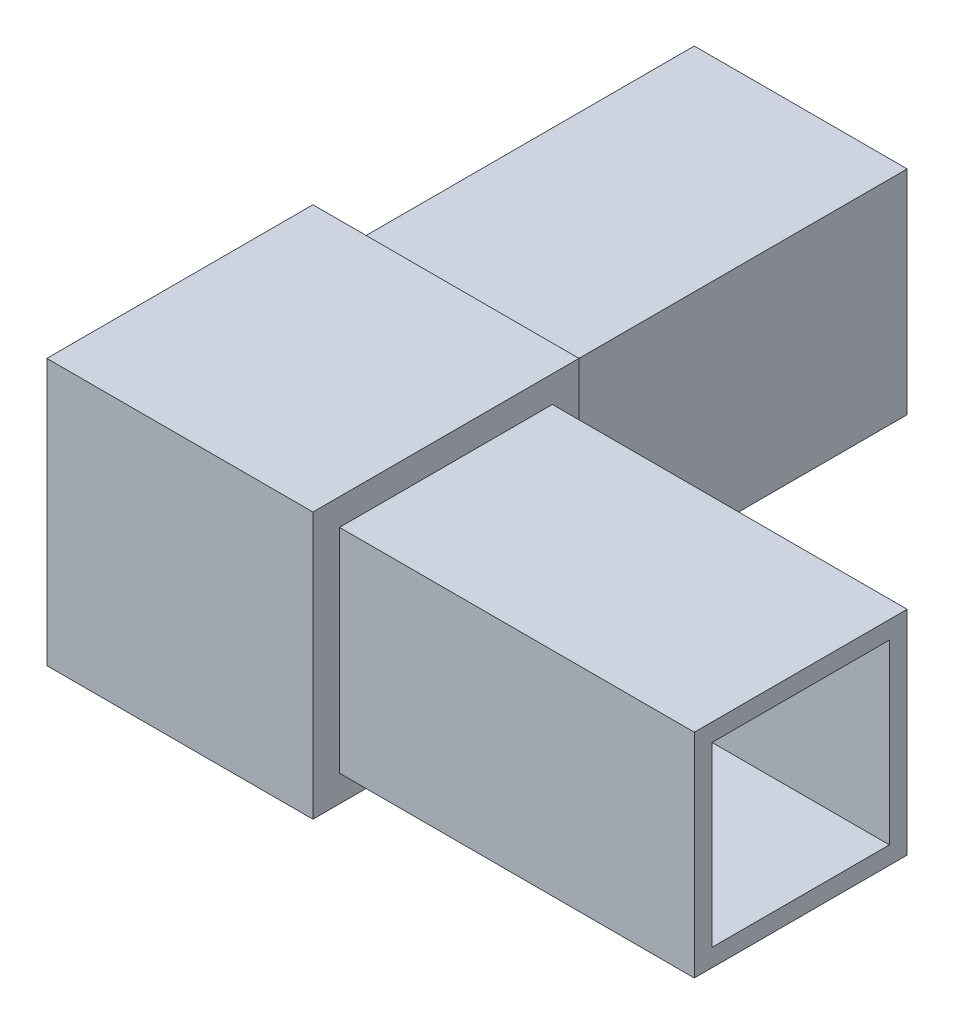
ISO-10303-21;
HEADER;
FILE_DESCRIPTION(('STEP AP214'),'2;1');
FILE_NAME('part.step','',(''),(''),'','','');
FILE_SCHEMA(('AUTOMOTIVE_DESIGN { 1 0 10303 214 1 1 1 1 }'));
ENDSEC;
DATA;
#1=APPLICATION_CONTEXT('core data for automotive mechanical design processes');
#2=APPLICATION_PROTOCOL_DEFINITION('international standard','automotive_design',2000,#1);
#3=PRODUCT_CONTEXT('',#1,'mechanical');
#4=PRODUCT('Part','Part','',(#3));
#5=PRODUCT_RELATED_PRODUCT_CATEGORY('part','',(#4));
#6=PRODUCT_DEFINITION_FORMATION('','',#4);
#7=PRODUCT_DEFINITION_CONTEXT('part definition',#1,'design');
#8=PRODUCT_DEFINITION('design','',#6,#7);
#9=PRODUCT_DEFINITION_SHAPE('','',#8);
#10=(LENGTH_UNIT() NAMED_UNIT(*) SI_UNIT(.MILLI.,.METRE.));
#11=(NAMED_UNIT(*) PLANE_ANGLE_UNIT() SI_UNIT($,.RADIAN.));
#12=(NAMED_UNIT(*) SI_UNIT($,.STERADIAN.) SOLID_ANGLE_UNIT());
#13=UNCERTAINTY_MEASURE_WITH_UNIT(LENGTH_MEASURE(1.E-05),#10,'distance_accuracy_value','');
#14=(GEOMETRIC_REPRESENTATION_CONTEXT(3) GLOBAL_UNCERTAINTY_ASSIGNED_CONTEXT((#13)) GLOBAL_UNIT_ASSIGNED_CONTEXT((#10,
#11,#12)) REPRESENTATION_CONTEXT('',''));
#15=CARTESIAN_POINT('',(0.,0.,0.));
#16=DIRECTION('',(0.,0.,1.));
#17=DIRECTION('',(1.,0.,0.));
#18=AXIS2_PLACEMENT_3D('',#15,#16,#17);
#19=CARTESIAN_POINT('',(55.,30.,-14.0461219660689));
#20=DIRECTION('',(-1.,0.,0.));
#21=DIRECTION('',(0.,0.,1.));
#22=AXIS2_PLACEMENT_3D('',#19,#20,#21);
#23=PLANE('',#22);
#24=DIRECTION('',(0.,-1.,0.));
#25=VECTOR('',#24,1.);
#26=CARTESIAN_POINT('',(55.,27.,12.));
#27=LINE('',#26,#25);
#28=CARTESIAN_POINT('',(55.,27.,12.));
#29=VERTEX_POINT('',#28);
#30=CARTESIAN_POINT('',(55.,3.,12.));
#31=VERTEX_POINT('',#30);
#32=EDGE_CURVE('E341',#29,#31,#27,.T.);
#33=ORIENTED_EDGE('',*,*,#32,.T.);
#34=DIRECTION('',(0.,0.,-1.));
#35=VECTOR('',#34,1.);
#36=CARTESIAN_POINT('',(55.,3.,12.));
#37=LINE('',#36,#35);
#38=CARTESIAN_POINT('',(55.,3.,-12.));
#39=VERTEX_POINT('',#38);
#40=EDGE_CURVE('E358',#31,#39,#37,.T.);
#41=ORIENTED_EDGE('',*,*,#40,.T.);
#42=DIRECTION('',(0.,1.,0.));
#43=VECTOR('',#42,1.);
#44=CARTESIAN_POINT('',(55.,3.,-12.));
#45=LINE('',#44,#43);
#46=CARTESIAN_POINT('',(55.,27.,-12.));
#47=VERTEX_POINT('',#46);
#48=EDGE_CURVE('E361',#39,#47,#45,.T.);
#49=ORIENTED_EDGE('',*,*,#48,.T.);
#50=DIRECTION('',(0.,0.,1.));
#51=VECTOR('',#50,1.);
#52=CARTESIAN_POINT('',(55.,27.,-12.));
#53=LINE('',#52,#51);
#54=EDGE_CURVE('E346',#47,#29,#53,.T.);
#55=ORIENTED_EDGE('',*,*,#54,.T.);
#56=EDGE_LOOP('',(#33,#41,#49,#55));
#57=FACE_BOUND('',#56,.T.);
#58=DIRECTION('',(0.,-1.,0.));
#59=VECTOR('',#58,1.);
#60=CARTESIAN_POINT('',(55.,27.,10.));
#61=LINE('',#60,#59);
#62=CARTESIAN_POINT('',(55.,25.,10.));
#63=VERTEX_POINT('',#62);
#64=CARTESIAN_POINT('',(55.,5.,10.));
#65=VERTEX_POINT('',#64);
#66=EDGE_CURVE('E283',#63,#65,#61,.T.);
#67=ORIENTED_EDGE('',*,*,#66,.F.);
#68=DIRECTION('',(0.,0.,1.));
#69=VECTOR('',#68,1.);
#70=CARTESIAN_POINT('',(55.,25.,-12.));
#71=LINE('',#70,#69);
#72=CARTESIAN_POINT('',(55.,25.,-9.99999999999999));
#73=VERTEX_POINT('',#72);
#74=EDGE_CURVE('E254',#73,#63,#71,.T.);
#75=ORIENTED_EDGE('',*,*,#74,.F.);
#76=DIRECTION('',(0.,1.,0.));
#77=VECTOR('',#76,1.);
#78=CARTESIAN_POINT('',(55.,3.,-9.99999999999999));
#79=LINE('',#78,#77);
#80=CARTESIAN_POINT('',(55.,5.,-9.99999999999999));
#81=VERTEX_POINT('',#80);
#82=EDGE_CURVE('E52',#81,#73,#79,.T.);
#83=ORIENTED_EDGE('',*,*,#82,.F.);
#84=DIRECTION('',(0.,0.,-1.));
#85=VECTOR('',#84,1.);
#86=CARTESIAN_POINT('',(55.,5.,12.));
#87=LINE('',#86,#85);
#88=EDGE_CURVE('E286',#65,#81,#87,.T.);
#89=ORIENTED_EDGE('',*,*,#88,.F.);
#90=EDGE_LOOP('',(#67,#75,#83,#89));
#91=FACE_BOUND('',#90,.T.);
#92=ADVANCED_FACE('F37',(#57,#91),#23,.F.);
#93=CARTESIAN_POINT('',(-80.1827679437956,30.,-14.0461219660689));
#94=DIRECTION('',(0.,1.,0.));
#95=DIRECTION('',(0.,0.,1.));
#96=AXIS2_PLACEMENT_3D('',#93,#94,#95);
#97=PLANE('',#96);
#98=DIRECTION('',(0.,0.,-1.));
#99=VECTOR('',#98,1.);
#100=CARTESIAN_POINT('',(15.,30.,-14.0461219660689));
#101=LINE('',#100,#99);
#102=CARTESIAN_POINT('',(15.,30.,15.));
#103=VERTEX_POINT('',#102);
#104=CARTESIAN_POINT('',(15.,30.,-15.));
#105=VERTEX_POINT('',#104);
#106=EDGE_CURVE('E45',#103,#105,#101,.T.);
#107=ORIENTED_EDGE('',*,*,#106,.T.);
#108=DIRECTION('',(1.,0.,0.));
#109=VECTOR('',#108,1.);
#110=CARTESIAN_POINT('',(-15.,30.,-15.));
#111=LINE('',#110,#109);
#112=CARTESIAN_POINT('',(-15.,30.,-15.));
#113=VERTEX_POINT('',#112);
#114=EDGE_CURVE('E339',#113,#105,#111,.T.);
#115=ORIENTED_EDGE('',*,*,#114,.F.);
#116=DIRECTION('',(0.,0.,-1.));
#117=VECTOR('',#116,1.);
#118=CARTESIAN_POINT('',(-15.,30.,-14.0461219660689));
#119=LINE('',#118,#117);
#120=CARTESIAN_POINT('',(-15.,30.,15.));
#121=VERTEX_POINT('',#120);
#122=EDGE_CURVE('E378',#121,#113,#119,.T.);
#123=ORIENTED_EDGE('',*,*,#122,.F.);
#124=DIRECTION('',(-1.,0.,0.));
#125=VECTOR('',#124,1.);
#126=CARTESIAN_POINT('',(-80.1827679437956,30.,15.));
#127=LINE('',#126,#125);
#128=EDGE_CURVE('E381',#103,#121,#127,.T.);
#129=ORIENTED_EDGE('',*,*,#128,.F.);
#130=EDGE_LOOP('',(#107,#115,#123,#129));
#131=FACE_BOUND('',#130,.T.);
#132=ADVANCED_FACE('F408',(#131),#97,.T.);
#133=CARTESIAN_POINT('',(-80.1827679437956,0.,-14.0461219660689));
#134=DIRECTION('',(0.,1.,0.));
#135=DIRECTION('',(0.,0.,1.));
#136=AXIS2_PLACEMENT_3D('',#133,#134,#135);
#137=PLANE('',#136);
#138=DIRECTION('',(-1.,0.,0.));
#139=VECTOR('',#138,1.);
#140=CARTESIAN_POINT('',(15.,0.,-15.));
#141=LINE('',#140,#139);
#142=CARTESIAN_POINT('',(15.,0.,-15.));
#143=VERTEX_POINT('',#142);
#144=CARTESIAN_POINT('',(-15.,0.,-15.));
#145=VERTEX_POINT('',#144);
#146=EDGE_CURVE('E335',#143,#145,#141,.T.);
#147=ORIENTED_EDGE('',*,*,#146,.F.);
#148=DIRECTION('',(0.,0.,-1.));
#149=VECTOR('',#148,1.);
#150=CARTESIAN_POINT('',(15.,0.,-14.0461219660689));
#151=LINE('',#150,#149);
#152=CARTESIAN_POINT('',(15.,0.,15.));
#153=VERTEX_POINT('',#152);
#154=EDGE_CURVE('E382',#153,#143,#151,.T.);
#155=ORIENTED_EDGE('',*,*,#154,.F.);
#156=DIRECTION('',(-1.,0.,0.));
#157=VECTOR('',#156,1.);
#158=CARTESIAN_POINT('',(-80.1827679437956,0.,15.));
#159=LINE('',#158,#157);
#160=CARTESIAN_POINT('',(-15.,0.,15.));
#161=VERTEX_POINT('',#160);
#162=EDGE_CURVE('E388',#153,#161,#159,.T.);
#163=ORIENTED_EDGE('',*,*,#162,.T.);
#164=DIRECTION('',(0.,0.,-1.));
#165=VECTOR('',#164,1.);
#166=CARTESIAN_POINT('',(-15.,0.,-14.0461219660689));
#167=LINE('',#166,#165);
#168=EDGE_CURVE('E377',#161,#145,#167,.T.);
#169=ORIENTED_EDGE('',*,*,#168,.T.);
#170=EDGE_LOOP('',(#147,#155,#163,#169));
#171=FACE_BOUND('',#170,.T.);
#172=ADVANCED_FACE('F397',(#171),#137,.F.);
#173=CARTESIAN_POINT('',(-15.,30.,-14.0461219660689));
#174=DIRECTION('',(-1.,0.,0.));
#175=DIRECTION('',(0.,0.,1.));
#176=AXIS2_PLACEMENT_3D('',#173,#174,#175);
#177=PLANE('',#176);
#178=ORIENTED_EDGE('',*,*,#122,.T.);
#179=DIRECTION('',(0.,1.,0.));
#180=VECTOR('',#179,1.);
#181=CARTESIAN_POINT('',(-15.,0.,-15.));
#182=LINE('',#181,#180);
#183=EDGE_CURVE('E337',#145,#113,#182,.T.);
#184=ORIENTED_EDGE('',*,*,#183,.F.);
#185=ORIENTED_EDGE('',*,*,#168,.F.);
#186=DIRECTION('',(0.,-1.,0.));
#187=VECTOR('',#186,1.);
#188=CARTESIAN_POINT('',(-15.,30.,15.));
#189=LINE('',#188,#187);
#190=EDGE_CURVE('E11',#121,#161,#189,.T.);
#191=ORIENTED_EDGE('',*,*,#190,.F.);
#192=EDGE_LOOP('',(#178,#184,#185,#191));
#193=FACE_BOUND('',#192,.T.);
#194=ADVANCED_FACE('F39',(#193),#177,.T.);
#195=CARTESIAN_POINT('',(15.,30.,-14.0461219660689));
#196=DIRECTION('',(-1.,0.,0.));
#197=DIRECTION('',(0.,0.,1.));
#198=AXIS2_PLACEMENT_3D('',#195,#196,#197);
#199=PLANE('',#198);
#200=DIRECTION('',(0.,0.,1.));
#201=VECTOR('',#200,1.);
#202=CARTESIAN_POINT('',(15.,27.,-12.));
#203=LINE('',#202,#201);
#204=CARTESIAN_POINT('',(15.,27.,-12.));
#205=VERTEX_POINT('',#204);
#206=CARTESIAN_POINT('',(15.,27.,12.));
#207=VERTEX_POINT('',#206);
#208=EDGE_CURVE('E352',#205,#207,#203,.T.);
#209=ORIENTED_EDGE('',*,*,#208,.F.);
#210=DIRECTION('',(0.,1.,0.));
#211=VECTOR('',#210,1.);
#212=CARTESIAN_POINT('',(15.,3.,-12.));
#213=LINE('',#212,#211);
#214=CARTESIAN_POINT('',(15.,3.,-12.));
#215=VERTEX_POINT('',#214);
#216=EDGE_CURVE('E349',#215,#205,#213,.T.);
#217=ORIENTED_EDGE('',*,*,#216,.F.);
#218=DIRECTION('',(0.,0.,-1.));
#219=VECTOR('',#218,1.);
#220=CARTESIAN_POINT('',(15.,3.,12.));
#221=LINE('',#220,#219);
#222=CARTESIAN_POINT('',(15.,3.,12.));
#223=VERTEX_POINT('',#222);
#224=EDGE_CURVE('E345',#223,#215,#221,.T.);
#225=ORIENTED_EDGE('',*,*,#224,.F.);
#226=DIRECTION('',(0.,-1.,0.));
#227=VECTOR('',#226,1.);
#228=CARTESIAN_POINT('',(15.,27.,12.));
#229=LINE('',#228,#227);
#230=EDGE_CURVE('E342',#207,#223,#229,.T.);
#231=ORIENTED_EDGE('',*,*,#230,.F.);
#232=EDGE_LOOP('',(#209,#217,#225,#231));
#233=FACE_BOUND('',#232,.T.);
#234=DIRECTION('',(0.,-1.,0.));
#235=VECTOR('',#234,1.);
#236=CARTESIAN_POINT('',(15.,30.,-15.));
#237=LINE('',#236,#235);
#238=EDGE_CURVE('E327',#105,#143,#237,.T.);
#239=ORIENTED_EDGE('',*,*,#238,.F.);
#240=ORIENTED_EDGE('',*,*,#106,.F.);
#241=DIRECTION('',(0.,-1.,0.));
#242=VECTOR('',#241,1.);
#243=CARTESIAN_POINT('',(15.,30.,15.));
#244=LINE('',#243,#242);
#245=EDGE_CURVE('E368',#103,#153,#244,.T.);
#246=ORIENTED_EDGE('',*,*,#245,.T.);
#247=ORIENTED_EDGE('',*,*,#154,.T.);
#248=EDGE_LOOP('',(#239,#240,#246,#247));
#249=FACE_BOUND('',#248,.T.);
#250=ADVANCED_FACE('F392',(#233,#249),#199,.F.);
#251=CARTESIAN_POINT('',(-80.1827679437956,30.,15.));
#252=DIRECTION('',(0.,0.,1.));
#253=DIRECTION('',(1.,0.,0.));
#254=AXIS2_PLACEMENT_3D('',#251,#252,#253);
#255=PLANE('',#254);
#256=ORIENTED_EDGE('',*,*,#162,.F.);
#257=ORIENTED_EDGE('',*,*,#245,.F.);
#258=ORIENTED_EDGE('',*,*,#128,.T.);
#259=ORIENTED_EDGE('',*,*,#190,.T.);
#260=EDGE_LOOP('',(#256,#257,#258,#259));
#261=FACE_BOUND('',#260,.T.);
#262=ADVANCED_FACE('F410',(#261),#255,.T.);
#263=CARTESIAN_POINT('',(15.,27.,12.));
#264=DIRECTION('',(0.,0.,1.));
#265=DIRECTION('',(1.,0.,0.));
#266=AXIS2_PLACEMENT_3D('',#263,#264,#265);
#267=PLANE('',#266);
#268=ORIENTED_EDGE('',*,*,#32,.F.);
#269=DIRECTION('',(1.,0.,0.));
#270=VECTOR('',#269,1.);
#271=CARTESIAN_POINT('',(15.,27.,12.));
#272=LINE('',#271,#270);
#273=EDGE_CURVE('E366',#207,#29,#272,.T.);
#274=ORIENTED_EDGE('',*,*,#273,.F.);
#275=ORIENTED_EDGE('',*,*,#230,.T.);
#276=DIRECTION('',(1.,0.,0.));
#277=VECTOR('',#276,1.);
#278=CARTESIAN_POINT('',(15.,3.,12.));
#279=LINE('',#278,#277);
#280=EDGE_CURVE('E355',#223,#31,#279,.T.);
#281=ORIENTED_EDGE('',*,*,#280,.T.);
#282=EDGE_LOOP('',(#268,#274,#275,#281));
#283=FACE_BOUND('',#282,.T.);
#284=ADVANCED_FACE('F412',(#283),#267,.T.);
#285=CARTESIAN_POINT('',(15.,27.,-12.));
#286=DIRECTION('',(0.,1.,0.));
#287=DIRECTION('',(0.,0.,1.));
#288=AXIS2_PLACEMENT_3D('',#285,#286,#287);
#289=PLANE('',#288);
#290=ORIENTED_EDGE('',*,*,#54,.F.);
#291=DIRECTION('',(1.,0.,0.));
#292=VECTOR('',#291,1.);
#293=CARTESIAN_POINT('',(15.,27.,-12.));
#294=LINE('',#293,#292);
#295=EDGE_CURVE('E369',#205,#47,#294,.T.);
#296=ORIENTED_EDGE('',*,*,#295,.F.);
#297=ORIENTED_EDGE('',*,*,#208,.T.);
#298=ORIENTED_EDGE('',*,*,#273,.T.);
#299=EDGE_LOOP('',(#290,#296,#297,#298));
#300=FACE_BOUND('',#299,.T.);
#301=ADVANCED_FACE('F417',(#300),#289,.T.);
#302=CARTESIAN_POINT('',(15.,3.,-12.));
#303=DIRECTION('',(0.,0.,-1.));
#304=DIRECTION('',(-1.,0.,0.));
#305=AXIS2_PLACEMENT_3D('',#302,#303,#304);
#306=PLANE('',#305);
#307=ORIENTED_EDGE('',*,*,#48,.F.);
#308=DIRECTION('',(1.,0.,0.));
#309=VECTOR('',#308,1.);
#310=CARTESIAN_POINT('',(15.,3.,-12.));
#311=LINE('',#310,#309);
#312=EDGE_CURVE('E371',#215,#39,#311,.T.);
#313=ORIENTED_EDGE('',*,*,#312,.F.);
#314=ORIENTED_EDGE('',*,*,#216,.T.);
#315=ORIENTED_EDGE('',*,*,#295,.T.);
#316=EDGE_LOOP('',(#307,#313,#314,#315));
#317=FACE_BOUND('',#316,.T.);
#318=ADVANCED_FACE('F441',(#317),#306,.T.);
#319=CARTESIAN_POINT('',(15.,3.,12.));
#320=DIRECTION('',(0.,-1.,0.));
#321=DIRECTION('',(0.,0.,-1.));
#322=AXIS2_PLACEMENT_3D('',#319,#320,#321);
#323=PLANE('',#322);
#324=ORIENTED_EDGE('',*,*,#40,.F.);
#325=ORIENTED_EDGE('',*,*,#280,.F.);
#326=ORIENTED_EDGE('',*,*,#224,.T.);
#327=ORIENTED_EDGE('',*,*,#312,.T.);
#328=EDGE_LOOP('',(#324,#325,#326,#327));
#329=FACE_BOUND('',#328,.T.);
#330=ADVANCED_FACE('F438',(#329),#323,.T.);
#331=CARTESIAN_POINT('',(15.,0.,-15.));
#332=DIRECTION('',(0.,0.,-1.));
#333=DIRECTION('',(-1.,0.,0.));
#334=AXIS2_PLACEMENT_3D('',#331,#332,#333);
#335=PLANE('',#334);
#336=DIRECTION('',(1.,0.,0.));
#337=VECTOR('',#336,1.);
#338=CARTESIAN_POINT('',(-12.,27.,-15.));
#339=LINE('',#338,#337);
#340=CARTESIAN_POINT('',(-12.,27.,-15.));
#341=VERTEX_POINT('',#340);
#342=CARTESIAN_POINT('',(12.,27.,-15.));
#343=VERTEX_POINT('',#342);
#344=EDGE_CURVE('E311',#341,#343,#339,.T.);
#345=ORIENTED_EDGE('',*,*,#344,.F.);
#346=DIRECTION('',(0.,1.,0.));
#347=VECTOR('',#346,1.);
#348=CARTESIAN_POINT('',(-12.,3.,-15.));
#349=LINE('',#348,#347);
#350=CARTESIAN_POINT('',(-12.,3.,-15.));
#351=VERTEX_POINT('',#350);
#352=EDGE_CURVE('E308',#351,#341,#349,.T.);
#353=ORIENTED_EDGE('',*,*,#352,.F.);
#354=DIRECTION('',(-1.,0.,0.));
#355=VECTOR('',#354,1.);
#356=CARTESIAN_POINT('',(12.,3.,-15.));
#357=LINE('',#356,#355);
#358=CARTESIAN_POINT('',(12.,3.,-15.));
#359=VERTEX_POINT('',#358);
#360=EDGE_CURVE('E304',#359,#351,#357,.T.);
#361=ORIENTED_EDGE('',*,*,#360,.F.);
#362=DIRECTION('',(0.,-1.,0.));
#363=VECTOR('',#362,1.);
#364=CARTESIAN_POINT('',(12.,27.,-15.));
#365=LINE('',#364,#363);
#366=EDGE_CURVE('E301',#343,#359,#365,.T.);
#367=ORIENTED_EDGE('',*,*,#366,.F.);
#368=EDGE_LOOP('',(#345,#353,#361,#367));
#369=FACE_BOUND('',#368,.T.);
#370=ORIENTED_EDGE('',*,*,#238,.T.);
#371=ORIENTED_EDGE('',*,*,#146,.T.);
#372=ORIENTED_EDGE('',*,*,#183,.T.);
#373=ORIENTED_EDGE('',*,*,#114,.T.);
#374=EDGE_LOOP('',(#370,#371,#372,#373));
#375=FACE_BOUND('',#374,.T.);
#376=ADVANCED_FACE('F401',(#369,#375),#335,.T.);
#377=CARTESIAN_POINT('',(12.,27.,-15.));
#378=DIRECTION('',(1.,0.,0.));
#379=DIRECTION('',(0.,1.,0.));
#380=AXIS2_PLACEMENT_3D('',#377,#378,#379);
#381=PLANE('',#380);
#382=DIRECTION('',(0.,-1.,0.));
#383=VECTOR('',#382,1.);
#384=CARTESIAN_POINT('',(12.,27.,-55.));
#385=LINE('',#384,#383);
#386=CARTESIAN_POINT('',(12.,27.,-55.));
#387=VERTEX_POINT('',#386);
#388=CARTESIAN_POINT('',(12.,3.,-55.));
#389=VERTEX_POINT('',#388);
#390=EDGE_CURVE('E236',#387,#389,#385,.T.);
#391=ORIENTED_EDGE('',*,*,#390,.F.);
#392=DIRECTION('',(0.,0.,-1.));
#393=VECTOR('',#392,1.);
#394=CARTESIAN_POINT('',(12.,27.,-15.));
#395=LINE('',#394,#393);
#396=EDGE_CURVE('E325',#343,#387,#395,.T.);
#397=ORIENTED_EDGE('',*,*,#396,.F.);
#398=ORIENTED_EDGE('',*,*,#366,.T.);
#399=DIRECTION('',(0.,0.,-1.));
#400=VECTOR('',#399,1.);
#401=CARTESIAN_POINT('',(12.,3.,-15.));
#402=LINE('',#401,#400);
#403=EDGE_CURVE('E314',#359,#389,#402,.T.);
#404=ORIENTED_EDGE('',*,*,#403,.T.);
#405=EDGE_LOOP('',(#391,#397,#398,#404));
#406=FACE_BOUND('',#405,.T.);
#407=ADVANCED_FACE('F451',(#406),#381,.T.);
#408=CARTESIAN_POINT('',(-12.,27.,-15.));
#409=DIRECTION('',(0.,1.,0.));
#410=DIRECTION('',(-1.,0.,0.));
#411=AXIS2_PLACEMENT_3D('',#408,#409,#410);
#412=PLANE('',#411);
#413=DIRECTION('',(1.,0.,0.));
#414=VECTOR('',#413,1.);
#415=CARTESIAN_POINT('',(-12.,27.,-55.));
#416=LINE('',#415,#414);
#417=CARTESIAN_POINT('',(-12.,27.,-55.));
#418=VERTEX_POINT('',#417);
#419=EDGE_CURVE('E305',#418,#387,#416,.T.);
#420=ORIENTED_EDGE('',*,*,#419,.F.);
#421=DIRECTION('',(0.,0.,-1.));
#422=VECTOR('',#421,1.);
#423=CARTESIAN_POINT('',(-12.,27.,-15.));
#424=LINE('',#423,#422);
#425=EDGE_CURVE('E328',#341,#418,#424,.T.);
#426=ORIENTED_EDGE('',*,*,#425,.F.);
#427=ORIENTED_EDGE('',*,*,#344,.T.);
#428=ORIENTED_EDGE('',*,*,#396,.T.);
#429=EDGE_LOOP('',(#420,#426,#427,#428));
#430=FACE_BOUND('',#429,.T.);
#431=ADVANCED_FACE('F455',(#430),#412,.T.);
#432=CARTESIAN_POINT('',(-12.,3.,-15.));
#433=DIRECTION('',(-1.,0.,0.));
#434=DIRECTION('',(0.,0.,1.));
#435=AXIS2_PLACEMENT_3D('',#432,#433,#434);
#436=PLANE('',#435);
#437=DIRECTION('',(0.,1.,0.));
#438=VECTOR('',#437,1.);
#439=CARTESIAN_POINT('',(-12.,3.,-55.));
#440=LINE('',#439,#438);
#441=CARTESIAN_POINT('',(-12.,3.,-55.));
#442=VERTEX_POINT('',#441);
#443=EDGE_CURVE('E320',#442,#418,#440,.T.);
#444=ORIENTED_EDGE('',*,*,#443,.F.);
#445=DIRECTION('',(0.,0.,-1.));
#446=VECTOR('',#445,1.);
#447=CARTESIAN_POINT('',(-12.,3.,-15.));
#448=LINE('',#447,#446);
#449=EDGE_CURVE('E330',#351,#442,#448,.T.);
#450=ORIENTED_EDGE('',*,*,#449,.F.);
#451=ORIENTED_EDGE('',*,*,#352,.T.);
#452=ORIENTED_EDGE('',*,*,#425,.T.);
#453=EDGE_LOOP('',(#444,#450,#451,#452));
#454=FACE_BOUND('',#453,.T.);
#455=ADVANCED_FACE('F459',(#454),#436,.T.);
#456=CARTESIAN_POINT('',(12.,3.,-15.));
#457=DIRECTION('',(0.,-1.,0.));
#458=DIRECTION('',(1.,0.,0.));
#459=AXIS2_PLACEMENT_3D('',#456,#457,#458);
#460=PLANE('',#459);
#461=DIRECTION('',(-1.,0.,0.));
#462=VECTOR('',#461,1.);
#463=CARTESIAN_POINT('',(12.,3.,-55.));
#464=LINE('',#463,#462);
#465=EDGE_CURVE('E317',#389,#442,#464,.T.);
#466=ORIENTED_EDGE('',*,*,#465,.F.);
#467=ORIENTED_EDGE('',*,*,#403,.F.);
#468=ORIENTED_EDGE('',*,*,#360,.T.);
#469=ORIENTED_EDGE('',*,*,#449,.T.);
#470=EDGE_LOOP('',(#466,#467,#468,#469));
#471=FACE_BOUND('',#470,.T.);
#472=ADVANCED_FACE('F434',(#471),#460,.T.);
#473=CARTESIAN_POINT('',(-80.1827679437956,30.,-55.));
#474=DIRECTION('',(0.,0.,-1.));
#475=DIRECTION('',(-1.,0.,0.));
#476=AXIS2_PLACEMENT_3D('',#473,#474,#475);
#477=PLANE('',#476);
#478=DIRECTION('',(1.,0.,0.));
#479=VECTOR('',#478,1.);
#480=CARTESIAN_POINT('',(-80.1827679437956,25.,-55.));
#481=LINE('',#480,#479);
#482=CARTESIAN_POINT('',(-10.,25.,-55.));
#483=VERTEX_POINT('',#482);
#484=CARTESIAN_POINT('',(9.99999999999999,25.,-55.));
#485=VERTEX_POINT('',#484);
#486=EDGE_CURVE('E276',#483,#485,#481,.T.);
#487=ORIENTED_EDGE('',*,*,#486,.F.);
#488=DIRECTION('',(0.,1.,0.));
#489=VECTOR('',#488,1.);
#490=CARTESIAN_POINT('',(-9.99999999999999,30.,-55.));
#491=LINE('',#490,#489);
#492=CARTESIAN_POINT('',(-10.,5.,-55.));
#493=VERTEX_POINT('',#492);
#494=EDGE_CURVE('E296',#493,#483,#491,.T.);
#495=ORIENTED_EDGE('',*,*,#494,.F.);
#496=DIRECTION('',(-1.,0.,0.));
#497=VECTOR('',#496,1.);
#498=CARTESIAN_POINT('',(-80.1827679437956,5.,-55.));
#499=LINE('',#498,#497);
#500=CARTESIAN_POINT('',(9.99999999999999,5.,-55.));
#501=VERTEX_POINT('',#500);
#502=EDGE_CURVE('E60',#501,#493,#499,.T.);
#503=ORIENTED_EDGE('',*,*,#502,.F.);
#504=DIRECTION('',(0.,-1.,0.));
#505=VECTOR('',#504,1.);
#506=CARTESIAN_POINT('',(9.99999999999999,30.,-55.));
#507=LINE('',#506,#505);
#508=EDGE_CURVE('E292',#485,#501,#507,.T.);
#509=ORIENTED_EDGE('',*,*,#508,.F.);
#510=EDGE_LOOP('',(#487,#495,#503,#509));
#511=FACE_BOUND('',#510,.T.);
#512=ORIENTED_EDGE('',*,*,#419,.T.);
#513=ORIENTED_EDGE('',*,*,#390,.T.);
#514=ORIENTED_EDGE('',*,*,#465,.T.);
#515=ORIENTED_EDGE('',*,*,#443,.T.);
#516=EDGE_LOOP('',(#512,#513,#514,#515));
#517=FACE_BOUND('',#516,.T.);
#518=ADVANCED_FACE('F431',(#511,#517),#477,.T.);
#519=CARTESIAN_POINT('',(-80.1827679437956,28.,-14.0461219660689));
#520=DIRECTION('',(0.,1.,0.));
#521=DIRECTION('',(0.,0.,1.));
#522=AXIS2_PLACEMENT_3D('',#519,#520,#521);
#523=PLANE('',#522);
#524=DIRECTION('',(0.,0.,-1.));
#525=VECTOR('',#524,1.);
#526=CARTESIAN_POINT('',(13.,28.,-14.0461219660689));
#527=LINE('',#526,#525);
#528=CARTESIAN_POINT('',(13.,28.,13.));
#529=VERTEX_POINT('',#528);
#530=CARTESIAN_POINT('',(13.,28.,-13.));
#531=VERTEX_POINT('',#530);
#532=EDGE_CURVE('E198',#529,#531,#527,.T.);
#533=ORIENTED_EDGE('',*,*,#532,.F.);
#534=DIRECTION('',(-1.,0.,0.));
#535=VECTOR('',#534,1.);
#536=CARTESIAN_POINT('',(-80.1827679437956,28.,13.));
#537=LINE('',#536,#535);
#538=CARTESIAN_POINT('',(-13.,28.,13.));
#539=VERTEX_POINT('',#538);
#540=EDGE_CURVE('E203',#529,#539,#537,.T.);
#541=ORIENTED_EDGE('',*,*,#540,.T.);
#542=DIRECTION('',(0.,0.,-1.));
#543=VECTOR('',#542,1.);
#544=CARTESIAN_POINT('',(-13.,28.,-14.0461219660689));
#545=LINE('',#544,#543);
#546=CARTESIAN_POINT('',(-13.,28.,-13.));
#547=VERTEX_POINT('',#546);
#548=EDGE_CURVE('E224',#539,#547,#545,.T.);
#549=ORIENTED_EDGE('',*,*,#548,.T.);
#550=DIRECTION('',(1.,0.,0.));
#551=VECTOR('',#550,1.);
#552=CARTESIAN_POINT('',(15.,28.,-13.));
#553=LINE('',#552,#551);
#554=EDGE_CURVE('E206',#547,#531,#553,.T.);
#555=ORIENTED_EDGE('',*,*,#554,.T.);
#556=EDGE_LOOP('',(#533,#541,#549,#555));
#557=FACE_BOUND('',#556,.T.);
#558=ADVANCED_FACE('F200',(#557),#523,.F.);
#559=CARTESIAN_POINT('',(-80.1827679437956,2.,-14.0461219660689));
#560=DIRECTION('',(0.,1.,0.));
#561=DIRECTION('',(0.,0.,1.));
#562=AXIS2_PLACEMENT_3D('',#559,#560,#561);
#563=PLANE('',#562);
#564=DIRECTION('',(-1.,0.,0.));
#565=VECTOR('',#564,1.);
#566=CARTESIAN_POINT('',(-80.1827679437956,2.,-13.));
#567=LINE('',#566,#565);
#568=CARTESIAN_POINT('',(13.,2.,-13.));
#569=VERTEX_POINT('',#568);
#570=CARTESIAN_POINT('',(-13.,2.,-13.));
#571=VERTEX_POINT('',#570);
#572=EDGE_CURVE('E231',#569,#571,#567,.T.);
#573=ORIENTED_EDGE('',*,*,#572,.T.);
#574=DIRECTION('',(0.,0.,-1.));
#575=VECTOR('',#574,1.);
#576=CARTESIAN_POINT('',(-13.,2.,-14.0461219660689));
#577=LINE('',#576,#575);
#578=CARTESIAN_POINT('',(-13.,2.,13.));
#579=VERTEX_POINT('',#578);
#580=EDGE_CURVE('E218',#579,#571,#577,.T.);
#581=ORIENTED_EDGE('',*,*,#580,.F.);
#582=DIRECTION('',(-1.,0.,0.));
#583=VECTOR('',#582,1.);
#584=CARTESIAN_POINT('',(-80.1827679437956,2.,13.));
#585=LINE('',#584,#583);
#586=CARTESIAN_POINT('',(13.,2.,13.));
#587=VERTEX_POINT('',#586);
#588=EDGE_CURVE('E234',#587,#579,#585,.T.);
#589=ORIENTED_EDGE('',*,*,#588,.F.);
#590=DIRECTION('',(0.,0.,-1.));
#591=VECTOR('',#590,1.);
#592=CARTESIAN_POINT('',(13.,2.,-14.0461219660689));
#593=LINE('',#592,#591);
#594=EDGE_CURVE('E215',#587,#569,#593,.T.);
#595=ORIENTED_EDGE('',*,*,#594,.T.);
#596=EDGE_LOOP('',(#573,#581,#589,#595));
#597=FACE_BOUND('',#596,.T.);
#598=ADVANCED_FACE('F509',(#597),#563,.T.);
#599=CARTESIAN_POINT('',(-13.,30.,-14.0461219660689));
#600=DIRECTION('',(-1.,0.,0.));
#601=DIRECTION('',(0.,0.,1.));
#602=AXIS2_PLACEMENT_3D('',#599,#600,#601);
#603=PLANE('',#602);
#604=ORIENTED_EDGE('',*,*,#548,.F.);
#605=DIRECTION('',(0.,-1.,0.));
#606=VECTOR('',#605,1.);
#607=CARTESIAN_POINT('',(-13.,30.,13.));
#608=LINE('',#607,#606);
#609=EDGE_CURVE('E209',#539,#579,#608,.T.);
#610=ORIENTED_EDGE('',*,*,#609,.T.);
#611=ORIENTED_EDGE('',*,*,#580,.T.);
#612=DIRECTION('',(0.,1.,0.));
#613=VECTOR('',#612,1.);
#614=CARTESIAN_POINT('',(-13.,0.,-13.));
#615=LINE('',#614,#613);
#616=EDGE_CURVE('E229',#571,#547,#615,.T.);
#617=ORIENTED_EDGE('',*,*,#616,.T.);
#618=EDGE_LOOP('',(#604,#610,#611,#617));
#619=FACE_BOUND('',#618,.T.);
#620=ADVANCED_FACE('F505',(#619),#603,.F.);
#621=CARTESIAN_POINT('',(13.,30.,-14.0461219660689));
#622=DIRECTION('',(-1.,0.,0.));
#623=DIRECTION('',(0.,0.,1.));
#624=AXIS2_PLACEMENT_3D('',#621,#622,#623);
#625=PLANE('',#624);
#626=DIRECTION('',(0.,0.,1.));
#627=VECTOR('',#626,1.);
#628=CARTESIAN_POINT('',(13.,25.,-12.));
#629=LINE('',#628,#627);
#630=CARTESIAN_POINT('',(13.,25.,-9.99999999999999));
#631=VERTEX_POINT('',#630);
#632=CARTESIAN_POINT('',(13.,25.,10.));
#633=VERTEX_POINT('',#632);
#634=EDGE_CURVE('E241',#631,#633,#629,.T.);
#635=ORIENTED_EDGE('',*,*,#634,.T.);
#636=DIRECTION('',(0.,-1.,0.));
#637=VECTOR('',#636,1.);
#638=CARTESIAN_POINT('',(13.,27.,10.));
#639=LINE('',#638,#637);
#640=CARTESIAN_POINT('',(13.,5.,10.));
#641=VERTEX_POINT('',#640);
#642=EDGE_CURVE('E251',#633,#641,#639,.T.);
#643=ORIENTED_EDGE('',*,*,#642,.T.);
#644=DIRECTION('',(0.,0.,-1.));
#645=VECTOR('',#644,1.);
#646=CARTESIAN_POINT('',(13.,5.,12.));
#647=LINE('',#646,#645);
#648=CARTESIAN_POINT('',(13.,5.,-9.99999999999999));
#649=VERTEX_POINT('',#648);
#650=EDGE_CURVE('E248',#641,#649,#647,.T.);
#651=ORIENTED_EDGE('',*,*,#650,.T.);
#652=DIRECTION('',(0.,1.,0.));
#653=VECTOR('',#652,1.);
#654=CARTESIAN_POINT('',(13.,3.,-9.99999999999999));
#655=LINE('',#654,#653);
#656=EDGE_CURVE('E245',#649,#631,#655,.T.);
#657=ORIENTED_EDGE('',*,*,#656,.T.);
#658=EDGE_LOOP('',(#635,#643,#651,#657));
#659=FACE_BOUND('',#658,.T.);
#660=DIRECTION('',(0.,-1.,0.));
#661=VECTOR('',#660,1.);
#662=CARTESIAN_POINT('',(13.,30.,-13.));
#663=LINE('',#662,#661);
#664=EDGE_CURVE('E238',#531,#569,#663,.T.);
#665=ORIENTED_EDGE('',*,*,#664,.T.);
#666=ORIENTED_EDGE('',*,*,#594,.F.);
#667=DIRECTION('',(0.,-1.,0.));
#668=VECTOR('',#667,1.);
#669=CARTESIAN_POINT('',(13.,30.,13.));
#670=LINE('',#669,#668);
#671=EDGE_CURVE('E212',#529,#587,#670,.T.);
#672=ORIENTED_EDGE('',*,*,#671,.F.);
#673=ORIENTED_EDGE('',*,*,#532,.T.);
#674=EDGE_LOOP('',(#665,#666,#672,#673));
#675=FACE_BOUND('',#674,.T.);
#676=ADVANCED_FACE('F213',(#659,#675),#625,.T.);
#677=CARTESIAN_POINT('',(-80.1827679437956,30.,13.));
#678=DIRECTION('',(0.,0.,1.));
#679=DIRECTION('',(1.,0.,0.));
#680=AXIS2_PLACEMENT_3D('',#677,#678,#679);
#681=PLANE('',#680);
#682=ORIENTED_EDGE('',*,*,#588,.T.);
#683=ORIENTED_EDGE('',*,*,#609,.F.);
#684=ORIENTED_EDGE('',*,*,#540,.F.);
#685=ORIENTED_EDGE('',*,*,#671,.T.);
#686=EDGE_LOOP('',(#682,#683,#684,#685));
#687=FACE_BOUND('',#686,.T.);
#688=ADVANCED_FACE('F221',(#687),#681,.F.);
#689=CARTESIAN_POINT('',(15.,27.,10.));
#690=DIRECTION('',(0.,0.,1.));
#691=DIRECTION('',(1.,0.,0.));
#692=AXIS2_PLACEMENT_3D('',#689,#690,#691);
#693=PLANE('',#692);
#694=ORIENTED_EDGE('',*,*,#66,.T.);
#695=DIRECTION('',(1.,0.,0.));
#696=VECTOR('',#695,1.);
#697=CARTESIAN_POINT('',(15.,5.,10.));
#698=LINE('',#697,#696);
#699=EDGE_CURVE('E244',#641,#65,#698,.T.);
#700=ORIENTED_EDGE('',*,*,#699,.F.);
#701=ORIENTED_EDGE('',*,*,#642,.F.);
#702=DIRECTION('',(1.,0.,0.));
#703=VECTOR('',#702,1.);
#704=CARTESIAN_POINT('',(15.,25.,10.));
#705=LINE('',#704,#703);
#706=EDGE_CURVE('E219',#633,#63,#705,.T.);
#707=ORIENTED_EDGE('',*,*,#706,.T.);
#708=EDGE_LOOP('',(#694,#700,#701,#707));
#709=FACE_BOUND('',#708,.T.);
#710=ADVANCED_FACE('F496',(#709),#693,.F.);
#711=CARTESIAN_POINT('',(15.,25.,-12.));
#712=DIRECTION('',(0.,1.,0.));
#713=DIRECTION('',(0.,0.,1.));
#714=AXIS2_PLACEMENT_3D('',#711,#712,#713);
#715=PLANE('',#714);
#716=ORIENTED_EDGE('',*,*,#74,.T.);
#717=ORIENTED_EDGE('',*,*,#706,.F.);
#718=ORIENTED_EDGE('',*,*,#634,.F.);
#719=DIRECTION('',(1.,0.,0.));
#720=VECTOR('',#719,1.);
#721=CARTESIAN_POINT('',(15.,25.,-9.99999999999999));
#722=LINE('',#721,#720);
#723=EDGE_CURVE('E258',#631,#73,#722,.T.);
#724=ORIENTED_EDGE('',*,*,#723,.T.);
#725=EDGE_LOOP('',(#716,#717,#718,#724));
#726=FACE_BOUND('',#725,.T.);
#727=ADVANCED_FACE('F493',(#726),#715,.F.);
#728=CARTESIAN_POINT('',(15.,3.,-9.99999999999999));
#729=DIRECTION('',(0.,0.,-1.));
#730=DIRECTION('',(-1.,0.,0.));
#731=AXIS2_PLACEMENT_3D('',#728,#729,#730);
#732=PLANE('',#731);
#733=ORIENTED_EDGE('',*,*,#82,.T.);
#734=ORIENTED_EDGE('',*,*,#723,.F.);
#735=ORIENTED_EDGE('',*,*,#656,.F.);
#736=DIRECTION('',(1.,0.,0.));
#737=VECTOR('',#736,1.);
#738=CARTESIAN_POINT('',(15.,5.,-9.99999999999999));
#739=LINE('',#738,#737);
#740=EDGE_CURVE('E260',#649,#81,#739,.T.);
#741=ORIENTED_EDGE('',*,*,#740,.T.);
#742=EDGE_LOOP('',(#733,#734,#735,#741));
#743=FACE_BOUND('',#742,.T.);
#744=ADVANCED_FACE('F489',(#743),#732,.F.);
#745=CARTESIAN_POINT('',(15.,5.,12.));
#746=DIRECTION('',(0.,-1.,0.));
#747=DIRECTION('',(0.,0.,-1.));
#748=AXIS2_PLACEMENT_3D('',#745,#746,#747);
#749=PLANE('',#748);
#750=ORIENTED_EDGE('',*,*,#88,.T.);
#751=ORIENTED_EDGE('',*,*,#740,.F.);
#752=ORIENTED_EDGE('',*,*,#650,.F.);
#753=ORIENTED_EDGE('',*,*,#699,.T.);
#754=EDGE_LOOP('',(#750,#751,#752,#753));
#755=FACE_BOUND('',#754,.T.);
#756=ADVANCED_FACE('F485',(#755),#749,.F.);
#757=CARTESIAN_POINT('',(15.,0.,-13.));
#758=DIRECTION('',(0.,0.,-1.));
#759=DIRECTION('',(-1.,0.,0.));
#760=AXIS2_PLACEMENT_3D('',#757,#758,#759);
#761=PLANE('',#760);
#762=DIRECTION('',(1.,0.,0.));
#763=VECTOR('',#762,1.);
#764=CARTESIAN_POINT('',(15.,25.,-13.));
#765=LINE('',#764,#763);
#766=CARTESIAN_POINT('',(-10.,25.,-13.));
#767=VERTEX_POINT('',#766);
#768=CARTESIAN_POINT('',(9.99999999999999,25.,-13.));
#769=VERTEX_POINT('',#768);
#770=EDGE_CURVE('E263',#767,#769,#765,.T.);
#771=ORIENTED_EDGE('',*,*,#770,.T.);
#772=DIRECTION('',(0.,-1.,0.));
#773=VECTOR('',#772,1.);
#774=CARTESIAN_POINT('',(9.99999999999999,0.,-13.));
#775=LINE('',#774,#773);
#776=CARTESIAN_POINT('',(9.99999999999999,5.,-13.));
#777=VERTEX_POINT('',#776);
#778=EDGE_CURVE('E273',#769,#777,#775,.T.);
#779=ORIENTED_EDGE('',*,*,#778,.T.);
#780=DIRECTION('',(-1.,0.,0.));
#781=VECTOR('',#780,1.);
#782=CARTESIAN_POINT('',(15.,5.,-13.));
#783=LINE('',#782,#781);
#784=CARTESIAN_POINT('',(-10.,5.,-13.));
#785=VERTEX_POINT('',#784);
#786=EDGE_CURVE('E270',#777,#785,#783,.T.);
#787=ORIENTED_EDGE('',*,*,#786,.T.);
#788=DIRECTION('',(0.,1.,0.));
#789=VECTOR('',#788,1.);
#790=CARTESIAN_POINT('',(-10.,0.,-13.));
#791=LINE('',#790,#789);
#792=EDGE_CURVE('E267',#785,#767,#791,.T.);
#793=ORIENTED_EDGE('',*,*,#792,.T.);
#794=EDGE_LOOP('',(#771,#779,#787,#793));
#795=FACE_BOUND('',#794,.T.);
#796=ORIENTED_EDGE('',*,*,#664,.F.);
#797=ORIENTED_EDGE('',*,*,#554,.F.);
#798=ORIENTED_EDGE('',*,*,#616,.F.);
#799=ORIENTED_EDGE('',*,*,#572,.F.);
#800=EDGE_LOOP('',(#796,#797,#798,#799));
#801=FACE_BOUND('',#800,.T.);
#802=ADVANCED_FACE('F481',(#795,#801),#761,.F.);
#803=CARTESIAN_POINT('',(9.99999999999999,27.,-15.));
#804=DIRECTION('',(1.,0.,0.));
#805=DIRECTION('',(0.,1.,0.));
#806=AXIS2_PLACEMENT_3D('',#803,#804,#805);
#807=PLANE('',#806);
#808=ORIENTED_EDGE('',*,*,#508,.T.);
#809=DIRECTION('',(0.,0.,-1.));
#810=VECTOR('',#809,1.);
#811=CARTESIAN_POINT('',(9.99999999999999,5.,-15.));
#812=LINE('',#811,#810);
#813=EDGE_CURVE('E266',#777,#501,#812,.T.);
#814=ORIENTED_EDGE('',*,*,#813,.F.);
#815=ORIENTED_EDGE('',*,*,#778,.F.);
#816=DIRECTION('',(0.,0.,-1.));
#817=VECTOR('',#816,1.);
#818=CARTESIAN_POINT('',(9.99999999999999,25.,-15.));
#819=LINE('',#818,#817);
#820=EDGE_CURVE('E255',#769,#485,#819,.T.);
#821=ORIENTED_EDGE('',*,*,#820,.T.);
#822=EDGE_LOOP('',(#808,#814,#815,#821));
#823=FACE_BOUND('',#822,.T.);
#824=ADVANCED_FACE('F477',(#823),#807,.F.);
#825=CARTESIAN_POINT('',(-12.,25.,-15.));
#826=DIRECTION('',(0.,1.,0.));
#827=DIRECTION('',(-1.,0.,0.));
#828=AXIS2_PLACEMENT_3D('',#825,#826,#827);
#829=PLANE('',#828);
#830=ORIENTED_EDGE('',*,*,#486,.T.);
#831=ORIENTED_EDGE('',*,*,#820,.F.);
#832=ORIENTED_EDGE('',*,*,#770,.F.);
#833=DIRECTION('',(0.,0.,-1.));
#834=VECTOR('',#833,1.);
#835=CARTESIAN_POINT('',(-10.,25.,-15.));
#836=LINE('',#835,#834);
#837=EDGE_CURVE('E278',#767,#483,#836,.T.);
#838=ORIENTED_EDGE('',*,*,#837,.T.);
#839=EDGE_LOOP('',(#830,#831,#832,#838));
#840=FACE_BOUND('',#839,.T.);
#841=ADVANCED_FACE('F473',(#840),#829,.F.);
#842=CARTESIAN_POINT('',(-10.,3.,-15.));
#843=DIRECTION('',(-1.,0.,0.));
#844=DIRECTION('',(0.,0.,1.));
#845=AXIS2_PLACEMENT_3D('',#842,#843,#844);
#846=PLANE('',#845);
#847=ORIENTED_EDGE('',*,*,#494,.T.);
#848=ORIENTED_EDGE('',*,*,#837,.F.);
#849=ORIENTED_EDGE('',*,*,#792,.F.);
#850=DIRECTION('',(0.,0.,-1.));
#851=VECTOR('',#850,1.);
#852=CARTESIAN_POINT('',(-10.,5.,-15.));
#853=LINE('',#852,#851);
#854=EDGE_CURVE('E280',#785,#493,#853,.T.);
#855=ORIENTED_EDGE('',*,*,#854,.T.);
#856=EDGE_LOOP('',(#847,#848,#849,#855));
#857=FACE_BOUND('',#856,.T.);
#858=ADVANCED_FACE('F470',(#857),#846,.F.);
#859=CARTESIAN_POINT('',(12.,5.,-15.));
#860=DIRECTION('',(0.,-1.,0.));
#861=DIRECTION('',(1.,0.,0.));
#862=AXIS2_PLACEMENT_3D('',#859,#860,#861);
#863=PLANE('',#862);
#864=ORIENTED_EDGE('',*,*,#502,.T.);
#865=ORIENTED_EDGE('',*,*,#854,.F.);
#866=ORIENTED_EDGE('',*,*,#786,.F.);
#867=ORIENTED_EDGE('',*,*,#813,.T.);
#868=EDGE_LOOP('',(#864,#865,#866,#867));
#869=FACE_BOUND('',#868,.T.);
#870=ADVANCED_FACE('F467',(#869),#863,.F.);
#871=CLOSED_SHELL('',(#92,#132,#172,#194,#250,#262,#284,#301,#318,#330,#376,#407,#431,#455,#472,
#518,#558,#598,#620,#676,#688,#710,#727,#744,#756,#802,#824,#841,#858,#870));
#872=MANIFOLD_SOLID_BREP('B2',#871);
#873=ADVANCED_BREP_SHAPE_REPRESENTATION('',(#18,#872),#14);
#874=SHAPE_DEFINITION_REPRESENTATION(#9,#873);
ENDSEC;
END-ISO-10303-21;
